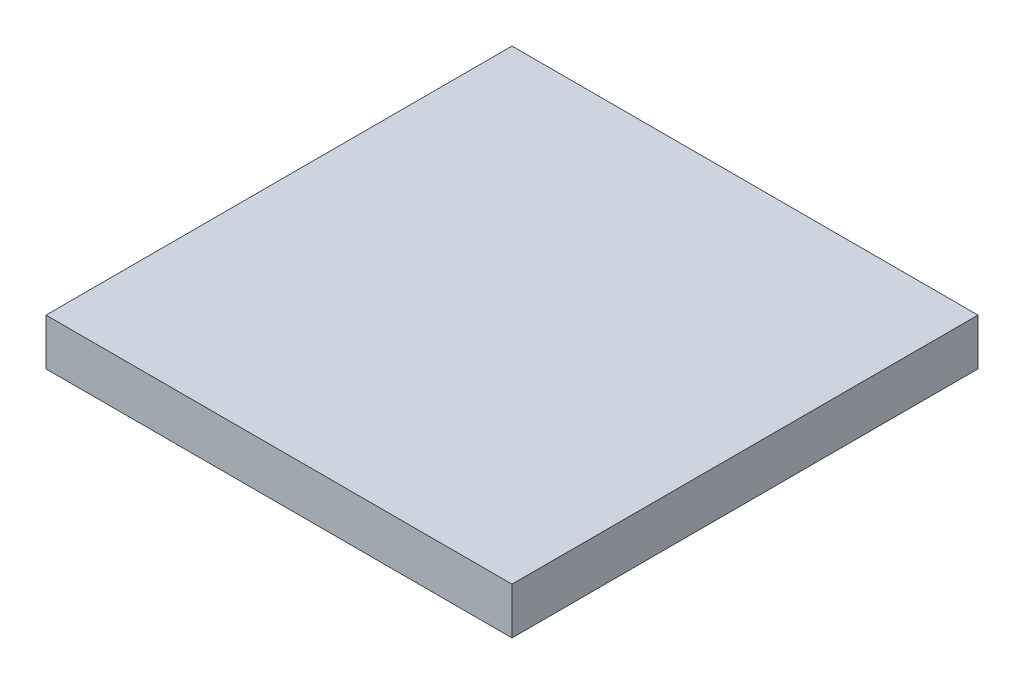
ISO-10303-21;
HEADER;
FILE_DESCRIPTION(('STEP AP214'),'2;1');
FILE_NAME('part.step','',(''),(''),'','','');
FILE_SCHEMA(('AUTOMOTIVE_DESIGN { 1 0 10303 214 1 1 1 1 }'));
ENDSEC;
DATA;
#1=APPLICATION_CONTEXT('core data for automotive mechanical design processes');
#2=APPLICATION_PROTOCOL_DEFINITION('international standard','automotive_design',2000,#1);
#3=PRODUCT_CONTEXT('',#1,'mechanical');
#4=PRODUCT('Part','Part','',(#3));
#5=PRODUCT_RELATED_PRODUCT_CATEGORY('part','',(#4));
#6=PRODUCT_DEFINITION_FORMATION('','',#4);
#7=PRODUCT_DEFINITION_CONTEXT('part definition',#1,'design');
#8=PRODUCT_DEFINITION('design','',#6,#7);
#9=PRODUCT_DEFINITION_SHAPE('','',#8);
#10=(LENGTH_UNIT() NAMED_UNIT(*) SI_UNIT(.MILLI.,.METRE.));
#11=(NAMED_UNIT(*) PLANE_ANGLE_UNIT() SI_UNIT($,.RADIAN.));
#12=(NAMED_UNIT(*) SI_UNIT($,.STERADIAN.) SOLID_ANGLE_UNIT());
#13=UNCERTAINTY_MEASURE_WITH_UNIT(LENGTH_MEASURE(1.E-05),#10,'distance_accuracy_value','');
#14=(GEOMETRIC_REPRESENTATION_CONTEXT(3) GLOBAL_UNCERTAINTY_ASSIGNED_CONTEXT((#13)) GLOBAL_UNIT_ASSIGNED_CONTEXT((#10,
#11,#12)) REPRESENTATION_CONTEXT('',''));
#15=CARTESIAN_POINT('',(0.,0.,0.));
#16=DIRECTION('',(0.,0.,1.));
#17=DIRECTION('',(1.,0.,0.));
#18=AXIS2_PLACEMENT_3D('',#15,#16,#17);
#19=CARTESIAN_POINT('',(12.5,-2.5,-12.5));
#20=DIRECTION('',(1.,0.,0.));
#21=DIRECTION('',(0.,0.,-1.));
#22=AXIS2_PLACEMENT_3D('',#19,#20,#21);
#23=PLANE('',#22);
#24=DIRECTION('',(0.,0.,-1.));
#25=VECTOR('',#24,1.);
#26=CARTESIAN_POINT('',(12.5,0.,-12.5));
#27=LINE('',#26,#25);
#28=CARTESIAN_POINT('',(12.5,0.,12.5));
#29=VERTEX_POINT('',#28);
#30=CARTESIAN_POINT('',(12.5,0.,-12.5));
#31=VERTEX_POINT('',#30);
#32=EDGE_CURVE('E104',#29,#31,#27,.T.);
#33=ORIENTED_EDGE('',*,*,#32,.F.);
#34=DIRECTION('',(0.,1.,0.));
#35=VECTOR('',#34,1.);
#36=CARTESIAN_POINT('',(12.5,-2.5,12.5));
#37=LINE('',#36,#35);
#38=CARTESIAN_POINT('',(12.5,-2.5,12.5));
#39=VERTEX_POINT('',#38);
#40=EDGE_CURVE('E11',#39,#29,#37,.T.);
#41=ORIENTED_EDGE('',*,*,#40,.F.);
#42=DIRECTION('',(0.,0.,-1.));
#43=VECTOR('',#42,1.);
#44=CARTESIAN_POINT('',(12.5,-2.5,-12.5));
#45=LINE('',#44,#43);
#46=CARTESIAN_POINT('',(12.5,-2.5,-12.5));
#47=VERTEX_POINT('',#46);
#48=EDGE_CURVE('E98',#39,#47,#45,.T.);
#49=ORIENTED_EDGE('',*,*,#48,.T.);
#50=DIRECTION('',(0.,1.,0.));
#51=VECTOR('',#50,1.);
#52=CARTESIAN_POINT('',(12.5,-2.5,-12.5));
#53=LINE('',#52,#51);
#54=EDGE_CURVE('E43',#47,#31,#53,.T.);
#55=ORIENTED_EDGE('',*,*,#54,.T.);
#56=EDGE_LOOP('',(#33,#41,#49,#55));
#57=FACE_BOUND('',#56,.T.);
#58=ADVANCED_FACE('F40',(#57),#23,.T.);
#59=CARTESIAN_POINT('',(-12.5,-2.5,12.5));
#60=DIRECTION('',(0.,0.,1.));
#61=DIRECTION('',(1.,0.,0.));
#62=AXIS2_PLACEMENT_3D('',#59,#60,#61);
#63=PLANE('',#62);
#64=DIRECTION('',(1.,0.,0.));
#65=VECTOR('',#64,1.);
#66=CARTESIAN_POINT('',(-12.5,0.,12.5));
#67=LINE('',#66,#65);
#68=CARTESIAN_POINT('',(-12.5,0.,12.5));
#69=VERTEX_POINT('',#68);
#70=EDGE_CURVE('E100',#69,#29,#67,.T.);
#71=ORIENTED_EDGE('',*,*,#70,.F.);
#72=DIRECTION('',(0.,1.,0.));
#73=VECTOR('',#72,1.);
#74=CARTESIAN_POINT('',(-12.5,-2.5,12.5));
#75=LINE('',#74,#73);
#76=CARTESIAN_POINT('',(-12.5,-2.5,12.5));
#77=VERTEX_POINT('',#76);
#78=EDGE_CURVE('E49',#77,#69,#75,.T.);
#79=ORIENTED_EDGE('',*,*,#78,.F.);
#80=DIRECTION('',(1.,0.,0.));
#81=VECTOR('',#80,1.);
#82=CARTESIAN_POINT('',(-12.5,-2.5,12.5));
#83=LINE('',#82,#81);
#84=EDGE_CURVE('E95',#77,#39,#83,.T.);
#85=ORIENTED_EDGE('',*,*,#84,.T.);
#86=ORIENTED_EDGE('',*,*,#40,.T.);
#87=EDGE_LOOP('',(#71,#79,#85,#86));
#88=FACE_BOUND('',#87,.T.);
#89=ADVANCED_FACE('F114',(#88),#63,.T.);
#90=CARTESIAN_POINT('',(-12.5,-2.5,-12.5));
#91=DIRECTION('',(-1.,0.,0.));
#92=DIRECTION('',(0.,0.,1.));
#93=AXIS2_PLACEMENT_3D('',#90,#91,#92);
#94=PLANE('',#93);
#95=DIRECTION('',(0.,0.,1.));
#96=VECTOR('',#95,1.);
#97=CARTESIAN_POINT('',(-12.5,0.,-12.5));
#98=LINE('',#97,#96);
#99=CARTESIAN_POINT('',(-12.5,0.,-12.5));
#100=VERTEX_POINT('',#99);
#101=EDGE_CURVE('E90',#100,#69,#98,.T.);
#102=ORIENTED_EDGE('',*,*,#101,.F.);
#103=DIRECTION('',(0.,1.,0.));
#104=VECTOR('',#103,1.);
#105=CARTESIAN_POINT('',(-12.5,-2.5,-12.5));
#106=LINE('',#105,#104);
#107=CARTESIAN_POINT('',(-12.5,-2.5,-12.5));
#108=VERTEX_POINT('',#107);
#109=EDGE_CURVE('E85',#108,#100,#106,.T.);
#110=ORIENTED_EDGE('',*,*,#109,.F.);
#111=DIRECTION('',(0.,0.,1.));
#112=VECTOR('',#111,1.);
#113=CARTESIAN_POINT('',(-12.5,-2.5,-12.5));
#114=LINE('',#113,#112);
#115=EDGE_CURVE('E88',#108,#77,#114,.T.);
#116=ORIENTED_EDGE('',*,*,#115,.T.);
#117=ORIENTED_EDGE('',*,*,#78,.T.);
#118=EDGE_LOOP('',(#102,#110,#116,#117));
#119=FACE_BOUND('',#118,.T.);
#120=ADVANCED_FACE('F87',(#119),#94,.T.);
#121=CARTESIAN_POINT('',(-12.5,-2.5,-12.5));
#122=DIRECTION('',(0.,0.,-1.));
#123=DIRECTION('',(-1.,0.,0.));
#124=AXIS2_PLACEMENT_3D('',#121,#122,#123);
#125=PLANE('',#124);
#126=DIRECTION('',(-1.,0.,0.));
#127=VECTOR('',#126,1.);
#128=CARTESIAN_POINT('',(-12.5,0.,-12.5));
#129=LINE('',#128,#127);
#130=EDGE_CURVE('E107',#31,#100,#129,.T.);
#131=ORIENTED_EDGE('',*,*,#130,.F.);
#132=ORIENTED_EDGE('',*,*,#54,.F.);
#133=DIRECTION('',(-1.,0.,0.));
#134=VECTOR('',#133,1.);
#135=CARTESIAN_POINT('',(-12.5,-2.5,-12.5));
#136=LINE('',#135,#134);
#137=EDGE_CURVE('E94',#47,#108,#136,.T.);
#138=ORIENTED_EDGE('',*,*,#137,.T.);
#139=ORIENTED_EDGE('',*,*,#109,.T.);
#140=EDGE_LOOP('',(#131,#132,#138,#139));
#141=FACE_BOUND('',#140,.T.);
#142=ADVANCED_FACE('F97',(#141),#125,.T.);
#143=CARTESIAN_POINT('',(0.,-2.5,0.));
#144=DIRECTION('',(0.,1.,0.));
#145=DIRECTION('',(0.,0.,1.));
#146=AXIS2_PLACEMENT_3D('',#143,#144,#145);
#147=PLANE('',#146);
#148=ORIENTED_EDGE('',*,*,#48,.F.);
#149=ORIENTED_EDGE('',*,*,#84,.F.);
#150=ORIENTED_EDGE('',*,*,#115,.F.);
#151=ORIENTED_EDGE('',*,*,#137,.F.);
#152=EDGE_LOOP('',(#148,#149,#150,#151));
#153=FACE_BOUND('',#152,.T.);
#154=ADVANCED_FACE('F93',(#153),#147,.F.);
#155=CARTESIAN_POINT('',(0.,0.,0.));
#156=DIRECTION('',(0.,1.,0.));
#157=DIRECTION('',(0.,0.,1.));
#158=AXIS2_PLACEMENT_3D('',#155,#156,#157);
#159=PLANE('',#158);
#160=ORIENTED_EDGE('',*,*,#32,.T.);
#161=ORIENTED_EDGE('',*,*,#130,.T.);
#162=ORIENTED_EDGE('',*,*,#101,.T.);
#163=ORIENTED_EDGE('',*,*,#70,.T.);
#164=EDGE_LOOP('',(#160,#161,#162,#163));
#165=FACE_BOUND('',#164,.T.);
#166=ADVANCED_FACE('F113',(#165),#159,.T.);
#167=CLOSED_SHELL('',(#58,#89,#120,#142,#154,#166));
#168=MANIFOLD_SOLID_BREP('B2',#167);
#169=ADVANCED_BREP_SHAPE_REPRESENTATION('',(#18,#168),#14);
#170=SHAPE_DEFINITION_REPRESENTATION(#9,#169);
ENDSEC;
END-ISO-10303-21;
